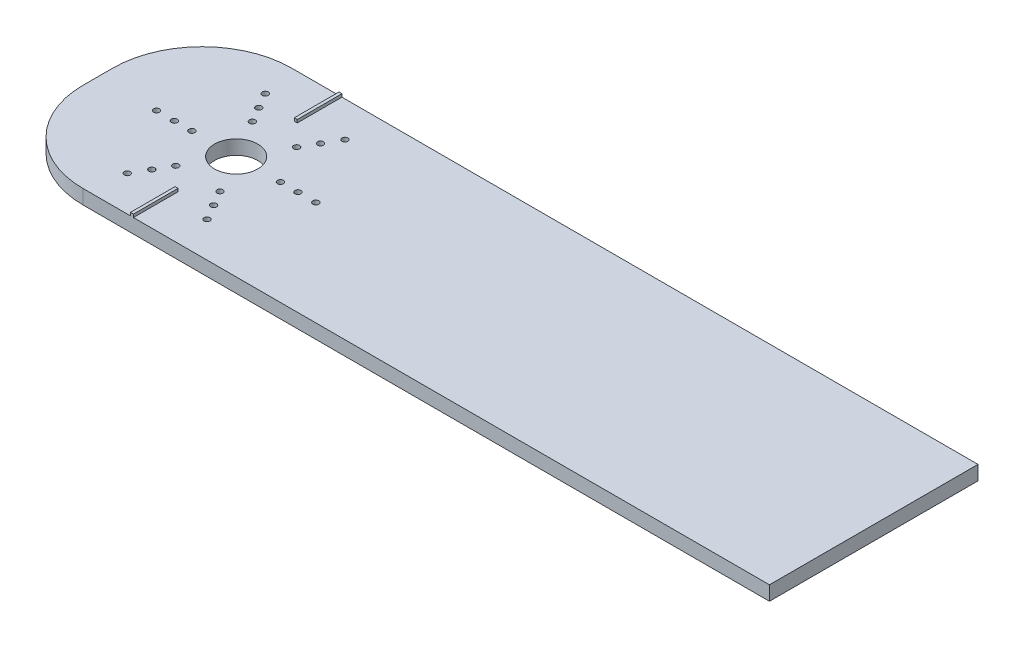
ISO-10303-21;
HEADER;
FILE_DESCRIPTION(('STEP AP214'),'2;1');
FILE_NAME('part.step','',(''),(''),'','','');
FILE_SCHEMA(('AUTOMOTIVE_DESIGN { 1 0 10303 214 1 1 1 1 }'));
ENDSEC;
DATA;
#1=APPLICATION_CONTEXT('core data for automotive mechanical design processes');
#2=APPLICATION_PROTOCOL_DEFINITION('international standard','automotive_design',2000,#1);
#3=PRODUCT_CONTEXT('',#1,'mechanical');
#4=PRODUCT('Part','Part','',(#3));
#5=PRODUCT_RELATED_PRODUCT_CATEGORY('part','',(#4));
#6=PRODUCT_DEFINITION_FORMATION('','',#4);
#7=PRODUCT_DEFINITION_CONTEXT('part definition',#1,'design');
#8=PRODUCT_DEFINITION('design','',#6,#7);
#9=PRODUCT_DEFINITION_SHAPE('','',#8);
#10=(LENGTH_UNIT() NAMED_UNIT(*) SI_UNIT(.MILLI.,.METRE.));
#11=(NAMED_UNIT(*) PLANE_ANGLE_UNIT() SI_UNIT($,.RADIAN.));
#12=(NAMED_UNIT(*) SI_UNIT($,.STERADIAN.) SOLID_ANGLE_UNIT());
#13=UNCERTAINTY_MEASURE_WITH_UNIT(LENGTH_MEASURE(1.E-05),#10,'distance_accuracy_value','');
#14=(GEOMETRIC_REPRESENTATION_CONTEXT(3) GLOBAL_UNCERTAINTY_ASSIGNED_CONTEXT((#13)) GLOBAL_UNIT_ASSIGNED_CONTEXT((#10,
#11,#12)) REPRESENTATION_CONTEXT('',''));
#15=CARTESIAN_POINT('',(0.,0.,0.));
#16=DIRECTION('',(0.,0.,1.));
#17=DIRECTION('',(1.,0.,0.));
#18=AXIS2_PLACEMENT_3D('',#15,#16,#17);
#19=CARTESIAN_POINT('',(0.,2.4,0.));
#20=DIRECTION('',(0.,1.,0.));
#21=DIRECTION('',(0.,0.,1.));
#22=AXIS2_PLACEMENT_3D('',#19,#20,#21);
#23=PLANE('',#22);
#24=CARTESIAN_POINT('',(24.2379461756374,2.4,-15.061181958097));
#25=DIRECTION('',(0.,1.,0.));
#26=DIRECTION('',(0.,0.,1.));
#27=AXIS2_PLACEMENT_3D('',#24,#25,#26);
#28=CIRCLE('',#27,0.499999999999995);
#29=CARTESIAN_POINT('',(24.2379461756374,2.4,-14.561181958097));
#30=VERTEX_POINT('',#29);
#31=EDGE_CURVE('E201',#30,#30,#28,.T.);
#32=ORIENTED_EDGE('',*,*,#31,.F.);
#33=EDGE_LOOP('',(#32));
#34=FACE_BOUND('',#33,.T.);
#35=CARTESIAN_POINT('',(33.8929461756374,2.4,-21.4957507082154));
#36=DIRECTION('',(0.,1.,0.));
#37=DIRECTION('',(0.,0.,1.));
#38=AXIS2_PLACEMENT_3D('',#35,#36,#37);
#39=CIRCLE('',#38,0.499999999999998);
#40=CARTESIAN_POINT('',(33.8929461756374,2.4,-20.9957507082154));
#41=VERTEX_POINT('',#40);
#42=EDGE_CURVE('E232',#41,#41,#39,.T.);
#43=ORIENTED_EDGE('',*,*,#42,.F.);
#44=EDGE_LOOP('',(#43));
#45=FACE_BOUND('',#44,.T.);
#46=CARTESIAN_POINT('',(30.8879461756374,2.4,-21.4957507082154));
#47=DIRECTION('',(0.,1.,0.));
#48=DIRECTION('',(0.,0.,1.));
#49=AXIS2_PLACEMENT_3D('',#46,#47,#48);
#50=CIRCLE('',#49,0.499999999999998);
#51=CARTESIAN_POINT('',(30.8879461756374,2.4,-20.9957507082154));
#52=VERTEX_POINT('',#51);
#53=EDGE_CURVE('E231',#52,#52,#50,.T.);
#54=ORIENTED_EDGE('',*,*,#53,.F.);
#55=EDGE_LOOP('',(#54));
#56=FACE_BOUND('',#55,.T.);
#57=CARTESIAN_POINT('',(7.15294617563741,2.4,-21.4957507082153));
#58=DIRECTION('',(0.,1.,0.));
#59=DIRECTION('',(0.,0.,1.));
#60=AXIS2_PLACEMENT_3D('',#57,#58,#59);
#61=CIRCLE('',#60,0.499999999999999);
#62=CARTESIAN_POINT('',(7.15294617563741,2.4,-20.9957507082153));
#63=VERTEX_POINT('',#62);
#64=EDGE_CURVE('E244',#63,#63,#61,.T.);
#65=ORIENTED_EDGE('',*,*,#64,.F.);
#66=EDGE_LOOP('',(#65));
#67=FACE_BOUND('',#66,.T.);
#68=CARTESIAN_POINT('',(25.7054461756374,2.4,-12.5193973979897));
#69=DIRECTION('',(0.,1.,0.));
#70=DIRECTION('',(0.,0.,1.));
#71=AXIS2_PLACEMENT_3D('',#68,#69,#70);
#72=CIRCLE('',#71,0.499999999999998);
#73=CARTESIAN_POINT('',(25.7054461756374,2.4,-12.0193973979897));
#74=VERTEX_POINT('',#73);
#75=EDGE_CURVE('E202',#74,#74,#72,.T.);
#76=ORIENTED_EDGE('',*,*,#75,.F.);
#77=EDGE_LOOP('',(#76));
#78=FACE_BOUND('',#77,.T.);
#79=CARTESIAN_POINT('',(27.2079461756374,2.4,-9.91699105961743));
#80=DIRECTION('',(0.,1.,0.));
#81=DIRECTION('',(0.,0.,1.));
#82=AXIS2_PLACEMENT_3D('',#79,#80,#81);
#83=CIRCLE('',#82,0.499999999999998);
#84=CARTESIAN_POINT('',(27.2079461756374,2.4,-9.41699105961743));
#85=VERTEX_POINT('',#84);
#86=EDGE_CURVE('E208',#85,#85,#83,.T.);
#87=ORIENTED_EDGE('',*,*,#86,.F.);
#88=EDGE_LOOP('',(#87));
#89=FACE_BOUND('',#88,.T.);
#90=CARTESIAN_POINT('',(16.8079461756374,2.4,-15.061181958097));
#91=DIRECTION('',(0.,1.,0.));
#92=DIRECTION('',(0.,0.,1.));
#93=AXIS2_PLACEMENT_3D('',#90,#91,#92);
#94=CIRCLE('',#93,0.499999999999998);
#95=CARTESIAN_POINT('',(16.8079461756374,2.4,-14.561181958097));
#96=VERTEX_POINT('',#95);
#97=EDGE_CURVE('E214',#96,#96,#94,.T.);
#98=ORIENTED_EDGE('',*,*,#97,.F.);
#99=EDGE_LOOP('',(#98));
#100=FACE_BOUND('',#99,.T.);
#101=CARTESIAN_POINT('',(15.3404461756374,2.4,-12.5193973979897));
#102=DIRECTION('',(0.,1.,0.));
#103=DIRECTION('',(0.,0.,1.));
#104=AXIS2_PLACEMENT_3D('',#101,#102,#103);
#105=CIRCLE('',#104,0.500000000000001);
#106=CARTESIAN_POINT('',(15.3404461756374,2.4,-12.0193973979897));
#107=VERTEX_POINT('',#106);
#108=EDGE_CURVE('E220',#107,#107,#105,.T.);
#109=ORIENTED_EDGE('',*,*,#108,.F.);
#110=EDGE_LOOP('',(#109));
#111=FACE_BOUND('',#110,.T.);
#112=CARTESIAN_POINT('',(13.8379461756374,2.4,-9.91699105961747));
#113=DIRECTION('',(0.,1.,0.));
#114=DIRECTION('',(0.,0.,1.));
#115=AXIS2_PLACEMENT_3D('',#112,#113,#114);
#116=CIRCLE('',#115,0.499999999999997);
#117=CARTESIAN_POINT('',(13.8379461756374,2.4,-9.41699105961747));
#118=VERTEX_POINT('',#117);
#119=EDGE_CURVE('E197',#118,#118,#116,.T.);
#120=ORIENTED_EDGE('',*,*,#119,.F.);
#121=EDGE_LOOP('',(#120));
#122=FACE_BOUND('',#121,.T.);
#123=CARTESIAN_POINT('',(15.3404461756373,2.4,-30.4721040184411));
#124=DIRECTION('',(0.,1.,0.));
#125=DIRECTION('',(0.,0.,1.));
#126=AXIS2_PLACEMENT_3D('',#123,#124,#125);
#127=CIRCLE('',#126,0.500000000000003);
#128=CARTESIAN_POINT('',(15.3404461756373,2.4,-29.9721040184411));
#129=VERTEX_POINT('',#128);
#130=EDGE_CURVE('E286',#129,#129,#127,.T.);
#131=ORIENTED_EDGE('',*,*,#130,.F.);
#132=EDGE_LOOP('',(#131));
#133=FACE_BOUND('',#132,.T.);
#134=CARTESIAN_POINT('',(13.8379461756374,2.4,-33.0745103568133));
#135=DIRECTION('',(0.,1.,0.));
#136=DIRECTION('',(0.,0.,1.));
#137=AXIS2_PLACEMENT_3D('',#134,#135,#136);
#138=CIRCLE('',#137,0.499999999999999);
#139=CARTESIAN_POINT('',(13.8379461756374,2.4,-32.5745103568133));
#140=VERTEX_POINT('',#139);
#141=EDGE_CURVE('E292',#140,#140,#138,.T.);
#142=ORIENTED_EDGE('',*,*,#141,.F.);
#143=EDGE_LOOP('',(#142));
#144=FACE_BOUND('',#143,.T.);
#145=CARTESIAN_POINT('',(24.2379461756374,2.4,-27.9303194583338));
#146=DIRECTION('',(0.,1.,0.));
#147=DIRECTION('',(0.,0.,1.));
#148=AXIS2_PLACEMENT_3D('',#145,#146,#147);
#149=CIRCLE('',#148,0.500000000000001);
#150=CARTESIAN_POINT('',(24.2379461756374,2.4,-27.4303194583338));
#151=VERTEX_POINT('',#150);
#152=EDGE_CURVE('E298',#151,#151,#149,.T.);
#153=ORIENTED_EDGE('',*,*,#152,.F.);
#154=EDGE_LOOP('',(#153));
#155=FACE_BOUND('',#154,.T.);
#156=CARTESIAN_POINT('',(25.7054461756374,2.4,-30.4721040184411));
#157=DIRECTION('',(0.,1.,0.));
#158=DIRECTION('',(0.,0.,1.));
#159=AXIS2_PLACEMENT_3D('',#156,#157,#158);
#160=CIRCLE('',#159,0.500000000000001);
#161=CARTESIAN_POINT('',(25.7054461756374,2.4,-29.9721040184411));
#162=VERTEX_POINT('',#161);
#163=EDGE_CURVE('E255',#162,#162,#160,.T.);
#164=ORIENTED_EDGE('',*,*,#163,.F.);
#165=EDGE_LOOP('',(#164));
#166=FACE_BOUND('',#165,.T.);
#167=CARTESIAN_POINT('',(27.2079461756374,2.4,-33.0745103568134));
#168=DIRECTION('',(0.,1.,0.));
#169=DIRECTION('',(0.,0.,1.));
#170=AXIS2_PLACEMENT_3D('',#167,#168,#169);
#171=CIRCLE('',#170,0.500000000000001);
#172=CARTESIAN_POINT('',(27.2079461756374,2.4,-32.5745103568134));
#173=VERTEX_POINT('',#172);
#174=EDGE_CURVE('E256',#173,#173,#171,.T.);
#175=ORIENTED_EDGE('',*,*,#174,.F.);
#176=EDGE_LOOP('',(#175));
#177=FACE_BOUND('',#176,.T.);
#178=CARTESIAN_POINT('',(27.9529461756374,2.4,-21.4957507082154));
#179=DIRECTION('',(0.,1.,0.));
#180=DIRECTION('',(0.,0.,1.));
#181=AXIS2_PLACEMENT_3D('',#178,#179,#180);
#182=CIRCLE('',#181,0.499999999999998);
#183=CARTESIAN_POINT('',(27.9529461756374,2.4,-20.9957507082154));
#184=VERTEX_POINT('',#183);
#185=EDGE_CURVE('E262',#184,#184,#182,.T.);
#186=ORIENTED_EDGE('',*,*,#185,.F.);
#187=EDGE_LOOP('',(#186));
#188=FACE_BOUND('',#187,.T.);
#189=CARTESIAN_POINT('',(20.5229461756374,2.4,-21.4957507082153));
#190=DIRECTION('',(0.,1.,0.));
#191=DIRECTION('',(0.,0.,1.));
#192=AXIS2_PLACEMENT_3D('',#189,#190,#191);
#193=CIRCLE('',#192,3.625);
#194=CARTESIAN_POINT('',(20.5229461756374,2.4,-17.8707507082153));
#195=VERTEX_POINT('',#194);
#196=EDGE_CURVE('E268',#195,#195,#193,.T.);
#197=ORIENTED_EDGE('',*,*,#196,.F.);
#198=EDGE_LOOP('',(#197));
#199=FACE_BOUND('',#198,.T.);
#200=CARTESIAN_POINT('',(13.0929461756374,2.4,-21.4957507082153));
#201=DIRECTION('',(0.,1.,0.));
#202=DIRECTION('',(0.,0.,1.));
#203=AXIS2_PLACEMENT_3D('',#200,#201,#202);
#204=CIRCLE('',#203,0.499999999999999);
#205=CARTESIAN_POINT('',(13.0929461756374,2.4,-20.9957507082153));
#206=VERTEX_POINT('',#205);
#207=EDGE_CURVE('E274',#206,#206,#204,.T.);
#208=ORIENTED_EDGE('',*,*,#207,.F.);
#209=EDGE_LOOP('',(#208));
#210=FACE_BOUND('',#209,.T.);
#211=CARTESIAN_POINT('',(10.1579461756374,2.4,-21.4957507082153));
#212=DIRECTION('',(0.,1.,0.));
#213=DIRECTION('',(0.,0.,1.));
#214=AXIS2_PLACEMENT_3D('',#211,#212,#213);
#215=CIRCLE('',#214,0.499999999999999);
#216=CARTESIAN_POINT('',(10.1579461756374,2.4,-20.9957507082153));
#217=VERTEX_POINT('',#216);
#218=EDGE_CURVE('E243',#217,#217,#215,.T.);
#219=ORIENTED_EDGE('',*,*,#218,.F.);
#220=EDGE_LOOP('',(#219));
#221=FACE_BOUND('',#220,.T.);
#222=CARTESIAN_POINT('',(16.8079461756373,2.4,-27.9303194583337));
#223=DIRECTION('',(0.,1.,0.));
#224=DIRECTION('',(0.,0.,1.));
#225=AXIS2_PLACEMENT_3D('',#222,#223,#224);
#226=CIRCLE('',#225,0.499999999999999);
#227=CARTESIAN_POINT('',(16.8079461756373,2.4,-27.4303194583337));
#228=VERTEX_POINT('',#227);
#229=EDGE_CURVE('E285',#228,#228,#226,.T.);
#230=ORIENTED_EDGE('',*,*,#229,.F.);
#231=EDGE_LOOP('',(#230));
#232=FACE_BOUND('',#231,.T.);
#233=DIRECTION('',(0.,0.,1.));
#234=VECTOR('',#233,1.);
#235=CARTESIAN_POINT('',(-2.67705382436262,2.4,-38.9957507082153));
#236=LINE('',#235,#234);
#237=CARTESIAN_POINT('',(-2.67705382436261,2.4,-23.9957507082153));
#238=VERTEX_POINT('',#237);
#239=CARTESIAN_POINT('',(-2.67705382436261,2.4,-18.9957507082153));
#240=VERTEX_POINT('',#239);
#241=EDGE_CURVE('E312',#238,#240,#236,.T.);
#242=ORIENTED_EDGE('',*,*,#241,.T.);
#243=CARTESIAN_POINT('',(12.3229461756374,2.4,-18.9957507082153));
#244=DIRECTION('',(0.,1.,0.));
#245=DIRECTION('',(0.,0.,1.));
#246=AXIS2_PLACEMENT_3D('',#243,#244,#245);
#247=CIRCLE('',#246,15.);
#248=CARTESIAN_POINT('',(12.3229461756374,2.4,-3.99575070821528));
#249=VERTEX_POINT('',#248);
#250=EDGE_CURVE('E41',#240,#249,#247,.T.);
#251=ORIENTED_EDGE('',*,*,#250,.T.);
#252=DIRECTION('',(1.,0.,0.));
#253=VECTOR('',#252,1.);
#254=CARTESIAN_POINT('',(-2.6770538243626,2.4,-3.99575070821528));
#255=LINE('',#254,#253);
#256=CARTESIAN_POINT('',(20.2729461756374,2.4,-3.99575070821528));
#257=VERTEX_POINT('',#256);
#258=EDGE_CURVE('E315',#249,#257,#255,.T.);
#259=ORIENTED_EDGE('',*,*,#258,.T.);
#260=DIRECTION('',(0.,0.,1.));
#261=VECTOR('',#260,1.);
#262=CARTESIAN_POINT('',(20.2729461756374,2.4,-3.99575070821528));
#263=LINE('',#262,#261);
#264=CARTESIAN_POINT('',(20.2729461756374,2.4,-11.4957507082153));
#265=VERTEX_POINT('',#264);
#266=EDGE_CURVE('E155',#265,#257,#263,.T.);
#267=ORIENTED_EDGE('',*,*,#266,.F.);
#268=DIRECTION('',(-1.,0.,0.));
#269=VECTOR('',#268,1.);
#270=CARTESIAN_POINT('',(20.2729461756374,2.4,-11.4957507082153));
#271=LINE('',#270,#269);
#272=CARTESIAN_POINT('',(20.7729461756374,2.4,-11.4957507082153));
#273=VERTEX_POINT('',#272);
#274=EDGE_CURVE('E373',#273,#265,#271,.T.);
#275=ORIENTED_EDGE('',*,*,#274,.F.);
#276=DIRECTION('',(0.,0.,-1.));
#277=VECTOR('',#276,1.);
#278=CARTESIAN_POINT('',(20.7729461756374,2.4,-3.99575070821528));
#279=LINE('',#278,#277);
#280=CARTESIAN_POINT('',(20.7729461756374,2.4,-3.99575070821528));
#281=VERTEX_POINT('',#280);
#282=EDGE_CURVE('E371',#281,#273,#279,.T.);
#283=ORIENTED_EDGE('',*,*,#282,.F.);
#284=CARTESIAN_POINT('',(127.522946175637,2.4,-3.99575070821528));
#285=VERTEX_POINT('',#284);
#286=EDGE_CURVE('E161',#281,#285,#255,.T.);
#287=ORIENTED_EDGE('',*,*,#286,.T.);
#288=DIRECTION('',(0.,0.,-1.));
#289=VECTOR('',#288,1.);
#290=CARTESIAN_POINT('',(127.522946175637,2.4,-38.9957507082153));
#291=LINE('',#290,#289);
#292=CARTESIAN_POINT('',(127.522946175637,2.4,-38.9957507082153));
#293=VERTEX_POINT('',#292);
#294=EDGE_CURVE('E317',#285,#293,#291,.T.);
#295=ORIENTED_EDGE('',*,*,#294,.T.);
#296=DIRECTION('',(-1.,0.,0.));
#297=VECTOR('',#296,1.);
#298=CARTESIAN_POINT('',(-2.67705382436262,2.4,-38.9957507082153));
#299=LINE('',#298,#297);
#300=CARTESIAN_POINT('',(20.7729461756374,2.4,-38.9957507082153));
#301=VERTEX_POINT('',#300);
#302=EDGE_CURVE('E320',#293,#301,#299,.T.);
#303=ORIENTED_EDGE('',*,*,#302,.T.);
#304=DIRECTION('',(0.,0.,-1.));
#305=VECTOR('',#304,1.);
#306=CARTESIAN_POINT('',(20.7729461756374,2.4,-38.9957507082153));
#307=LINE('',#306,#305);
#308=CARTESIAN_POINT('',(20.7729461756374,2.4,-31.4957507082153));
#309=VERTEX_POINT('',#308);
#310=EDGE_CURVE('E175',#309,#301,#307,.T.);
#311=ORIENTED_EDGE('',*,*,#310,.F.);
#312=DIRECTION('',(1.,0.,0.));
#313=VECTOR('',#312,1.);
#314=CARTESIAN_POINT('',(20.2729461756374,2.4,-31.4957507082153));
#315=LINE('',#314,#313);
#316=CARTESIAN_POINT('',(20.2729461756374,2.4,-31.4957507082153));
#317=VERTEX_POINT('',#316);
#318=EDGE_CURVE('E165',#317,#309,#315,.T.);
#319=ORIENTED_EDGE('',*,*,#318,.F.);
#320=DIRECTION('',(0.,0.,1.));
#321=VECTOR('',#320,1.);
#322=CARTESIAN_POINT('',(20.2729461756374,2.4,-38.9957507082153));
#323=LINE('',#322,#321);
#324=CARTESIAN_POINT('',(20.2729461756374,2.4,-38.9957507082153));
#325=VERTEX_POINT('',#324);
#326=EDGE_CURVE('E162',#325,#317,#323,.T.);
#327=ORIENTED_EDGE('',*,*,#326,.F.);
#328=CARTESIAN_POINT('',(12.3229461756374,2.4,-38.9957507082153));
#329=VERTEX_POINT('',#328);
#330=EDGE_CURVE('E319',#325,#329,#299,.T.);
#331=ORIENTED_EDGE('',*,*,#330,.T.);
#332=CARTESIAN_POINT('',(12.3229461756374,2.4,-23.9957507082153));
#333=DIRECTION('',(0.,1.,0.));
#334=DIRECTION('',(0.,0.,1.));
#335=AXIS2_PLACEMENT_3D('',#332,#333,#334);
#336=CIRCLE('',#335,15.);
#337=EDGE_CURVE('E345',#329,#238,#336,.T.);
#338=ORIENTED_EDGE('',*,*,#337,.T.);
#339=EDGE_LOOP('',(#242,#251,#259,#267,#275,#283,#287,#295,#303,#311,#319,#327,#331,#338));
#340=FACE_BOUND('',#339,.T.);
#341=ADVANCED_FACE('F33',(#34,#45,#56,#67,#78,#89,#100,#111,#122,#133,#144,#155,#166,#177,#188,
#199,#210,#221,#232,#340),#23,.T.);
#342=CARTESIAN_POINT('',(-2.67705382436262,2.4,-38.9957507082153));
#343=DIRECTION('',(1.,0.,0.));
#344=DIRECTION('',(0.,0.,-1.));
#345=AXIS2_PLACEMENT_3D('',#342,#343,#344);
#346=PLANE('',#345);
#347=DIRECTION('',(0.,0.,1.));
#348=VECTOR('',#347,1.);
#349=CARTESIAN_POINT('',(-2.67705382436262,0.,-38.9957507082153));
#350=LINE('',#349,#348);
#351=CARTESIAN_POINT('',(-2.67705382436261,0.,-23.9957507082153));
#352=VERTEX_POINT('',#351);
#353=CARTESIAN_POINT('',(-2.67705382436261,0.,-18.9957507082153));
#354=VERTEX_POINT('',#353);
#355=EDGE_CURVE('E309',#352,#354,#350,.T.);
#356=ORIENTED_EDGE('',*,*,#355,.T.);
#357=DIRECTION('',(0.,-1.,0.));
#358=VECTOR('',#357,1.);
#359=CARTESIAN_POINT('',(-2.67705382436261,2.4,-18.9957507082153));
#360=LINE('',#359,#358);
#361=EDGE_CURVE('E54',#354,#240,#360,.F.);
#362=ORIENTED_EDGE('',*,*,#361,.T.);
#363=ORIENTED_EDGE('',*,*,#241,.F.);
#364=DIRECTION('',(0.,-1.,0.));
#365=VECTOR('',#364,1.);
#366=CARTESIAN_POINT('',(-2.67705382436261,2.4,-23.9957507082153));
#367=LINE('',#366,#365);
#368=EDGE_CURVE('E341',#238,#352,#367,.T.);
#369=ORIENTED_EDGE('',*,*,#368,.T.);
#370=EDGE_LOOP('',(#356,#362,#363,#369));
#371=FACE_BOUND('',#370,.T.);
#372=ADVANCED_FACE('F359',(#371),#346,.F.);
#373=CARTESIAN_POINT('',(-2.6770538243626,2.4,-3.99575070821528));
#374=DIRECTION('',(0.,0.,-1.));
#375=DIRECTION('',(-1.,0.,0.));
#376=AXIS2_PLACEMENT_3D('',#373,#374,#375);
#377=PLANE('',#376);
#378=ORIENTED_EDGE('',*,*,#258,.F.);
#379=DIRECTION('',(0.,-1.,0.));
#380=VECTOR('',#379,1.);
#381=CARTESIAN_POINT('',(12.3229461756374,2.4,-3.99575070821528));
#382=LINE('',#381,#380);
#383=CARTESIAN_POINT('',(12.3229461756374,0.,-3.99575070821528));
#384=VERTEX_POINT('',#383);
#385=EDGE_CURVE('E334',#249,#384,#382,.T.);
#386=ORIENTED_EDGE('',*,*,#385,.T.);
#387=DIRECTION('',(1.,0.,0.));
#388=VECTOR('',#387,1.);
#389=CARTESIAN_POINT('',(-2.6770538243626,0.,-3.99575070821528));
#390=LINE('',#389,#388);
#391=CARTESIAN_POINT('',(127.522946175637,0.,-3.99575070821528));
#392=VERTEX_POINT('',#391);
#393=EDGE_CURVE('E324',#384,#392,#390,.T.);
#394=ORIENTED_EDGE('',*,*,#393,.T.);
#395=DIRECTION('',(0.,-1.,0.));
#396=VECTOR('',#395,1.);
#397=CARTESIAN_POINT('',(127.522946175637,2.4,-3.99575070821528));
#398=LINE('',#397,#396);
#399=EDGE_CURVE('E331',#285,#392,#398,.T.);
#400=ORIENTED_EDGE('',*,*,#399,.F.);
#401=ORIENTED_EDGE('',*,*,#286,.F.);
#402=DIRECTION('',(0.,-1.,0.));
#403=VECTOR('',#402,1.);
#404=CARTESIAN_POINT('',(20.7729461756374,2.9,-3.99575070821528));
#405=LINE('',#404,#403);
#406=CARTESIAN_POINT('',(20.7729461756374,2.9,-3.99575070821528));
#407=VERTEX_POINT('',#406);
#408=EDGE_CURVE('E139',#407,#281,#405,.T.);
#409=ORIENTED_EDGE('',*,*,#408,.F.);
#410=DIRECTION('',(1.,0.,0.));
#411=VECTOR('',#410,1.);
#412=CARTESIAN_POINT('',(20.2729461756374,2.9,-3.99575070821528));
#413=LINE('',#412,#411);
#414=CARTESIAN_POINT('',(20.2729461756374,2.9,-3.99575070821528));
#415=VERTEX_POINT('',#414);
#416=EDGE_CURVE('E146',#415,#407,#413,.T.);
#417=ORIENTED_EDGE('',*,*,#416,.F.);
#418=DIRECTION('',(0.,-1.,0.));
#419=VECTOR('',#418,1.);
#420=CARTESIAN_POINT('',(20.2729461756374,2.9,-3.99575070821528));
#421=LINE('',#420,#419);
#422=EDGE_CURVE('E353',#415,#257,#421,.T.);
#423=ORIENTED_EDGE('',*,*,#422,.T.);
#424=EDGE_LOOP('',(#378,#386,#394,#400,#401,#409,#417,#423));
#425=FACE_BOUND('',#424,.T.);
#426=ADVANCED_FACE('F159',(#425),#377,.F.);
#427=CARTESIAN_POINT('',(127.522946175637,2.4,-38.9957507082153));
#428=DIRECTION('',(-1.,0.,0.));
#429=DIRECTION('',(0.,0.,1.));
#430=AXIS2_PLACEMENT_3D('',#427,#428,#429);
#431=PLANE('',#430);
#432=DIRECTION('',(0.,0.,-1.));
#433=VECTOR('',#432,1.);
#434=CARTESIAN_POINT('',(127.522946175637,0.,-38.9957507082153));
#435=LINE('',#434,#433);
#436=CARTESIAN_POINT('',(127.522946175637,0.,-38.9957507082153));
#437=VERTEX_POINT('',#436);
#438=EDGE_CURVE('E326',#392,#437,#435,.T.);
#439=ORIENTED_EDGE('',*,*,#438,.T.);
#440=DIRECTION('',(0.,-1.,0.));
#441=VECTOR('',#440,1.);
#442=CARTESIAN_POINT('',(127.522946175637,2.4,-38.9957507082153));
#443=LINE('',#442,#441);
#444=EDGE_CURVE('E322',#293,#437,#443,.T.);
#445=ORIENTED_EDGE('',*,*,#444,.F.);
#446=ORIENTED_EDGE('',*,*,#294,.F.);
#447=ORIENTED_EDGE('',*,*,#399,.T.);
#448=EDGE_LOOP('',(#439,#445,#446,#447));
#449=FACE_BOUND('',#448,.T.);
#450=ADVANCED_FACE('F369',(#449),#431,.F.);
#451=CARTESIAN_POINT('',(-2.67705382436262,2.4,-38.9957507082153));
#452=DIRECTION('',(0.,0.,1.));
#453=DIRECTION('',(1.,0.,0.));
#454=AXIS2_PLACEMENT_3D('',#451,#452,#453);
#455=PLANE('',#454);
#456=DIRECTION('',(-1.,0.,0.));
#457=VECTOR('',#456,1.);
#458=CARTESIAN_POINT('',(-2.67705382436262,0.,-38.9957507082153));
#459=LINE('',#458,#457);
#460=CARTESIAN_POINT('',(12.3229461756374,0.,-38.9957507082153));
#461=VERTEX_POINT('',#460);
#462=EDGE_CURVE('E314',#437,#461,#459,.T.);
#463=ORIENTED_EDGE('',*,*,#462,.T.);
#464=DIRECTION('',(0.,-1.,0.));
#465=VECTOR('',#464,1.);
#466=CARTESIAN_POINT('',(12.3229461756374,2.4,-38.9957507082153));
#467=LINE('',#466,#465);
#468=EDGE_CURVE('E11',#461,#329,#467,.F.);
#469=ORIENTED_EDGE('',*,*,#468,.T.);
#470=ORIENTED_EDGE('',*,*,#330,.F.);
#471=DIRECTION('',(0.,-1.,0.));
#472=VECTOR('',#471,1.);
#473=CARTESIAN_POINT('',(20.2729461756374,2.9,-38.9957507082153));
#474=LINE('',#473,#472);
#475=CARTESIAN_POINT('',(20.2729461756374,2.9,-38.9957507082153));
#476=VERTEX_POINT('',#475);
#477=EDGE_CURVE('E180',#476,#325,#474,.T.);
#478=ORIENTED_EDGE('',*,*,#477,.F.);
#479=DIRECTION('',(-1.,0.,0.));
#480=VECTOR('',#479,1.);
#481=CARTESIAN_POINT('',(20.2729461756374,2.9,-38.9957507082153));
#482=LINE('',#481,#480);
#483=CARTESIAN_POINT('',(20.7729461756374,2.9,-38.9957507082153));
#484=VERTEX_POINT('',#483);
#485=EDGE_CURVE('E179',#484,#476,#482,.T.);
#486=ORIENTED_EDGE('',*,*,#485,.F.);
#487=DIRECTION('',(0.,-1.,0.));
#488=VECTOR('',#487,1.);
#489=CARTESIAN_POINT('',(20.7729461756374,2.9,-38.9957507082153));
#490=LINE('',#489,#488);
#491=EDGE_CURVE('E188',#484,#301,#490,.T.);
#492=ORIENTED_EDGE('',*,*,#491,.T.);
#493=ORIENTED_EDGE('',*,*,#302,.F.);
#494=ORIENTED_EDGE('',*,*,#444,.T.);
#495=EDGE_LOOP('',(#463,#469,#470,#478,#486,#492,#493,#494));
#496=FACE_BOUND('',#495,.T.);
#497=ADVANCED_FACE('F364',(#496),#455,.F.);
#498=CARTESIAN_POINT('',(0.,0.,0.));
#499=DIRECTION('',(0.,1.,0.));
#500=DIRECTION('',(0.,0.,1.));
#501=AXIS2_PLACEMENT_3D('',#498,#499,#500);
#502=PLANE('',#501);
#503=CARTESIAN_POINT('',(24.2379461756374,0.,-15.061181958097));
#504=DIRECTION('',(0.,1.,0.));
#505=DIRECTION('',(0.,0.,1.));
#506=AXIS2_PLACEMENT_3D('',#503,#504,#505);
#507=CIRCLE('',#506,0.499999999999995);
#508=CARTESIAN_POINT('',(24.2379461756374,0.,-14.561181958097));
#509=VERTEX_POINT('',#508);
#510=EDGE_CURVE('E235',#509,#509,#507,.T.);
#511=ORIENTED_EDGE('',*,*,#510,.T.);
#512=EDGE_LOOP('',(#511));
#513=FACE_BOUND('',#512,.T.);
#514=CARTESIAN_POINT('',(33.8929461756374,0.,-21.4957507082154));
#515=DIRECTION('',(0.,1.,0.));
#516=DIRECTION('',(0.,0.,1.));
#517=AXIS2_PLACEMENT_3D('',#514,#515,#516);
#518=CIRCLE('',#517,0.499999999999998);
#519=CARTESIAN_POINT('',(33.8929461756374,0.,-20.9957507082154));
#520=VERTEX_POINT('',#519);
#521=EDGE_CURVE('E228',#520,#520,#518,.T.);
#522=ORIENTED_EDGE('',*,*,#521,.T.);
#523=EDGE_LOOP('',(#522));
#524=FACE_BOUND('',#523,.T.);
#525=CARTESIAN_POINT('',(30.8879461756374,0.,-21.4957507082154));
#526=DIRECTION('',(0.,1.,0.));
#527=DIRECTION('',(0.,0.,1.));
#528=AXIS2_PLACEMENT_3D('',#525,#526,#527);
#529=CIRCLE('',#528,0.499999999999998);
#530=CARTESIAN_POINT('',(30.8879461756374,0.,-20.9957507082154));
#531=VERTEX_POINT('',#530);
#532=EDGE_CURVE('E247',#531,#531,#529,.T.);
#533=ORIENTED_EDGE('',*,*,#532,.T.);
#534=EDGE_LOOP('',(#533));
#535=FACE_BOUND('',#534,.T.);
#536=CARTESIAN_POINT('',(7.15294617563741,0.,-21.4957507082153));
#537=DIRECTION('',(0.,1.,0.));
#538=DIRECTION('',(0.,0.,1.));
#539=AXIS2_PLACEMENT_3D('',#536,#537,#538);
#540=CIRCLE('',#539,0.499999999999999);
#541=CARTESIAN_POINT('',(7.15294617563741,0.,-20.9957507082153));
#542=VERTEX_POINT('',#541);
#543=EDGE_CURVE('E240',#542,#542,#540,.T.);
#544=ORIENTED_EDGE('',*,*,#543,.T.);
#545=EDGE_LOOP('',(#544));
#546=FACE_BOUND('',#545,.T.);
#547=CARTESIAN_POINT('',(25.7054461756374,0.,-12.5193973979897));
#548=DIRECTION('',(0.,1.,0.));
#549=DIRECTION('',(0.,0.,1.));
#550=AXIS2_PLACEMENT_3D('',#547,#548,#549);
#551=CIRCLE('',#550,0.499999999999998);
#552=CARTESIAN_POINT('',(25.7054461756374,0.,-12.0193973979897));
#553=VERTEX_POINT('',#552);
#554=EDGE_CURVE('E198',#553,#553,#551,.T.);
#555=ORIENTED_EDGE('',*,*,#554,.T.);
#556=EDGE_LOOP('',(#555));
#557=FACE_BOUND('',#556,.T.);
#558=CARTESIAN_POINT('',(27.2079461756374,0.,-9.91699105961743));
#559=DIRECTION('',(0.,1.,0.));
#560=DIRECTION('',(0.,0.,1.));
#561=AXIS2_PLACEMENT_3D('',#558,#559,#560);
#562=CIRCLE('',#561,0.499999999999998);
#563=CARTESIAN_POINT('',(27.2079461756374,0.,-9.41699105961743));
#564=VERTEX_POINT('',#563);
#565=EDGE_CURVE('E205',#564,#564,#562,.T.);
#566=ORIENTED_EDGE('',*,*,#565,.T.);
#567=EDGE_LOOP('',(#566));
#568=FACE_BOUND('',#567,.T.);
#569=CARTESIAN_POINT('',(16.8079461756374,0.,-15.061181958097));
#570=DIRECTION('',(0.,1.,0.));
#571=DIRECTION('',(0.,0.,1.));
#572=AXIS2_PLACEMENT_3D('',#569,#570,#571);
#573=CIRCLE('',#572,0.499999999999998);
#574=CARTESIAN_POINT('',(16.8079461756374,0.,-14.561181958097));
#575=VERTEX_POINT('',#574);
#576=EDGE_CURVE('E211',#575,#575,#573,.T.);
#577=ORIENTED_EDGE('',*,*,#576,.T.);
#578=EDGE_LOOP('',(#577));
#579=FACE_BOUND('',#578,.T.);
#580=CARTESIAN_POINT('',(15.3404461756374,0.,-12.5193973979897));
#581=DIRECTION('',(0.,1.,0.));
#582=DIRECTION('',(0.,0.,1.));
#583=AXIS2_PLACEMENT_3D('',#580,#581,#582);
#584=CIRCLE('',#583,0.500000000000001);
#585=CARTESIAN_POINT('',(15.3404461756374,0.,-12.0193973979897));
#586=VERTEX_POINT('',#585);
#587=EDGE_CURVE('E217',#586,#586,#584,.T.);
#588=ORIENTED_EDGE('',*,*,#587,.T.);
#589=EDGE_LOOP('',(#588));
#590=FACE_BOUND('',#589,.T.);
#591=CARTESIAN_POINT('',(13.8379461756374,0.,-9.91699105961747));
#592=DIRECTION('',(0.,1.,0.));
#593=DIRECTION('',(0.,0.,1.));
#594=AXIS2_PLACEMENT_3D('',#591,#592,#593);
#595=CIRCLE('',#594,0.499999999999997);
#596=CARTESIAN_POINT('',(13.8379461756374,0.,-9.41699105961747));
#597=VERTEX_POINT('',#596);
#598=EDGE_CURVE('E223',#597,#597,#595,.T.);
#599=ORIENTED_EDGE('',*,*,#598,.T.);
#600=EDGE_LOOP('',(#599));
#601=FACE_BOUND('',#600,.T.);
#602=CARTESIAN_POINT('',(15.3404461756373,0.,-30.4721040184411));
#603=DIRECTION('',(0.,1.,0.));
#604=DIRECTION('',(0.,0.,1.));
#605=AXIS2_PLACEMENT_3D('',#602,#603,#604);
#606=CIRCLE('',#605,0.500000000000003);
#607=CARTESIAN_POINT('',(15.3404461756373,0.,-29.9721040184411));
#608=VERTEX_POINT('',#607);
#609=EDGE_CURVE('E282',#608,#608,#606,.T.);
#610=ORIENTED_EDGE('',*,*,#609,.T.);
#611=EDGE_LOOP('',(#610));
#612=FACE_BOUND('',#611,.T.);
#613=CARTESIAN_POINT('',(13.8379461756374,0.,-33.0745103568133));
#614=DIRECTION('',(0.,1.,0.));
#615=DIRECTION('',(0.,0.,1.));
#616=AXIS2_PLACEMENT_3D('',#613,#614,#615);
#617=CIRCLE('',#616,0.499999999999999);
#618=CARTESIAN_POINT('',(13.8379461756374,0.,-32.5745103568133));
#619=VERTEX_POINT('',#618);
#620=EDGE_CURVE('E289',#619,#619,#617,.T.);
#621=ORIENTED_EDGE('',*,*,#620,.T.);
#622=EDGE_LOOP('',(#621));
#623=FACE_BOUND('',#622,.T.);
#624=CARTESIAN_POINT('',(24.2379461756374,0.,-27.9303194583338));
#625=DIRECTION('',(0.,1.,0.));
#626=DIRECTION('',(0.,0.,1.));
#627=AXIS2_PLACEMENT_3D('',#624,#625,#626);
#628=CIRCLE('',#627,0.500000000000001);
#629=CARTESIAN_POINT('',(24.2379461756374,0.,-27.4303194583338));
#630=VERTEX_POINT('',#629);
#631=EDGE_CURVE('E295',#630,#630,#628,.T.);
#632=ORIENTED_EDGE('',*,*,#631,.T.);
#633=EDGE_LOOP('',(#632));
#634=FACE_BOUND('',#633,.T.);
#635=CARTESIAN_POINT('',(25.7054461756374,0.,-30.4721040184411));
#636=DIRECTION('',(0.,1.,0.));
#637=DIRECTION('',(0.,0.,1.));
#638=AXIS2_PLACEMENT_3D('',#635,#636,#637);
#639=CIRCLE('',#638,0.500000000000001);
#640=CARTESIAN_POINT('',(25.7054461756374,0.,-29.9721040184411));
#641=VERTEX_POINT('',#640);
#642=EDGE_CURVE('E301',#641,#641,#639,.T.);
#643=ORIENTED_EDGE('',*,*,#642,.T.);
#644=EDGE_LOOP('',(#643));
#645=FACE_BOUND('',#644,.T.);
#646=CARTESIAN_POINT('',(27.2079461756374,0.,-33.0745103568134));
#647=DIRECTION('',(0.,1.,0.));
#648=DIRECTION('',(0.,0.,1.));
#649=AXIS2_PLACEMENT_3D('',#646,#647,#648);
#650=CIRCLE('',#649,0.500000000000001);
#651=CARTESIAN_POINT('',(27.2079461756374,0.,-32.5745103568134));
#652=VERTEX_POINT('',#651);
#653=EDGE_CURVE('E252',#652,#652,#650,.T.);
#654=ORIENTED_EDGE('',*,*,#653,.T.);
#655=EDGE_LOOP('',(#654));
#656=FACE_BOUND('',#655,.T.);
#657=CARTESIAN_POINT('',(27.9529461756374,0.,-21.4957507082154));
#658=DIRECTION('',(0.,1.,0.));
#659=DIRECTION('',(0.,0.,1.));
#660=AXIS2_PLACEMENT_3D('',#657,#658,#659);
#661=CIRCLE('',#660,0.499999999999998);
#662=CARTESIAN_POINT('',(27.9529461756374,0.,-20.9957507082154));
#663=VERTEX_POINT('',#662);
#664=EDGE_CURVE('E259',#663,#663,#661,.T.);
#665=ORIENTED_EDGE('',*,*,#664,.T.);
#666=EDGE_LOOP('',(#665));
#667=FACE_BOUND('',#666,.T.);
#668=CARTESIAN_POINT('',(20.5229461756374,0.,-21.4957507082153));
#669=DIRECTION('',(0.,1.,0.));
#670=DIRECTION('',(0.,0.,1.));
#671=AXIS2_PLACEMENT_3D('',#668,#669,#670);
#672=CIRCLE('',#671,3.625);
#673=CARTESIAN_POINT('',(20.5229461756374,0.,-17.8707507082153));
#674=VERTEX_POINT('',#673);
#675=EDGE_CURVE('E265',#674,#674,#672,.T.);
#676=ORIENTED_EDGE('',*,*,#675,.T.);
#677=EDGE_LOOP('',(#676));
#678=FACE_BOUND('',#677,.T.);
#679=CARTESIAN_POINT('',(13.0929461756374,0.,-21.4957507082153));
#680=DIRECTION('',(0.,1.,0.));
#681=DIRECTION('',(0.,0.,1.));
#682=AXIS2_PLACEMENT_3D('',#679,#680,#681);
#683=CIRCLE('',#682,0.499999999999999);
#684=CARTESIAN_POINT('',(13.0929461756374,0.,-20.9957507082153));
#685=VERTEX_POINT('',#684);
#686=EDGE_CURVE('E271',#685,#685,#683,.T.);
#687=ORIENTED_EDGE('',*,*,#686,.T.);
#688=EDGE_LOOP('',(#687));
#689=FACE_BOUND('',#688,.T.);
#690=CARTESIAN_POINT('',(10.1579461756374,0.,-21.4957507082153));
#691=DIRECTION('',(0.,1.,0.));
#692=DIRECTION('',(0.,0.,1.));
#693=AXIS2_PLACEMENT_3D('',#690,#691,#692);
#694=CIRCLE('',#693,0.499999999999999);
#695=CARTESIAN_POINT('',(10.1579461756374,0.,-20.9957507082153));
#696=VERTEX_POINT('',#695);
#697=EDGE_CURVE('E277',#696,#696,#694,.T.);
#698=ORIENTED_EDGE('',*,*,#697,.T.);
#699=EDGE_LOOP('',(#698));
#700=FACE_BOUND('',#699,.T.);
#701=CARTESIAN_POINT('',(16.8079461756373,0.,-27.9303194583337));
#702=DIRECTION('',(0.,1.,0.));
#703=DIRECTION('',(0.,0.,1.));
#704=AXIS2_PLACEMENT_3D('',#701,#702,#703);
#705=CIRCLE('',#704,0.499999999999999);
#706=CARTESIAN_POINT('',(16.8079461756373,0.,-27.4303194583337));
#707=VERTEX_POINT('',#706);
#708=EDGE_CURVE('E306',#707,#707,#705,.T.);
#709=ORIENTED_EDGE('',*,*,#708,.T.);
#710=EDGE_LOOP('',(#709));
#711=FACE_BOUND('',#710,.T.);
#712=ORIENTED_EDGE('',*,*,#393,.F.);
#713=CARTESIAN_POINT('',(12.3229461756374,0.,-18.9957507082153));
#714=DIRECTION('',(0.,1.,0.));
#715=DIRECTION('',(0.,0.,1.));
#716=AXIS2_PLACEMENT_3D('',#713,#714,#715);
#717=CIRCLE('',#716,15.);
#718=EDGE_CURVE('E339',#384,#354,#717,.F.);
#719=ORIENTED_EDGE('',*,*,#718,.T.);
#720=ORIENTED_EDGE('',*,*,#355,.F.);
#721=CARTESIAN_POINT('',(12.3229461756374,0.,-23.9957507082153));
#722=DIRECTION('',(0.,1.,0.));
#723=DIRECTION('',(0.,0.,1.));
#724=AXIS2_PLACEMENT_3D('',#721,#722,#723);
#725=CIRCLE('',#724,15.);
#726=EDGE_CURVE('E337',#352,#461,#725,.F.);
#727=ORIENTED_EDGE('',*,*,#726,.T.);
#728=ORIENTED_EDGE('',*,*,#462,.F.);
#729=ORIENTED_EDGE('',*,*,#438,.F.);
#730=EDGE_LOOP('',(#712,#719,#720,#727,#728,#729));
#731=FACE_BOUND('',#730,.T.);
#732=ADVANCED_FACE('F357',(#513,#524,#535,#546,#557,#568,#579,#590,#601,#612,#623,#634,#645,
#656,#667,#678,#689,#700,#711,#731),#502,.F.);
#733=CARTESIAN_POINT('',(16.8079461756373,0.,-27.9303194583337));
#734=DIRECTION('',(0.,1.,0.));
#735=DIRECTION('',(0.,0.,1.));
#736=AXIS2_PLACEMENT_3D('',#733,#734,#735);
#737=CYLINDRICAL_SURFACE('',#736,0.499999999999999);
#738=ORIENTED_EDGE('',*,*,#708,.F.);
#739=EDGE_LOOP('',(#738));
#740=FACE_BOUND('',#739,.T.);
#741=ORIENTED_EDGE('',*,*,#229,.T.);
#742=EDGE_LOOP('',(#741));
#743=FACE_BOUND('',#742,.T.);
#744=ADVANCED_FACE('F406',(#740,#743),#737,.F.);
#745=CARTESIAN_POINT('',(10.1579461756374,0.,-21.4957507082153));
#746=DIRECTION('',(0.,1.,0.));
#747=DIRECTION('',(0.,0.,1.));
#748=AXIS2_PLACEMENT_3D('',#745,#746,#747);
#749=CYLINDRICAL_SURFACE('',#748,0.499999999999999);
#750=ORIENTED_EDGE('',*,*,#697,.F.);
#751=EDGE_LOOP('',(#750));
#752=FACE_BOUND('',#751,.T.);
#753=ORIENTED_EDGE('',*,*,#218,.T.);
#754=EDGE_LOOP('',(#753));
#755=FACE_BOUND('',#754,.T.);
#756=ADVANCED_FACE('F647',(#752,#755),#749,.F.);
#757=CARTESIAN_POINT('',(13.0929461756374,0.,-21.4957507082153));
#758=DIRECTION('',(0.,1.,0.));
#759=DIRECTION('',(0.,0.,1.));
#760=AXIS2_PLACEMENT_3D('',#757,#758,#759);
#761=CYLINDRICAL_SURFACE('',#760,0.499999999999999);
#762=ORIENTED_EDGE('',*,*,#686,.F.);
#763=EDGE_LOOP('',(#762));
#764=FACE_BOUND('',#763,.T.);
#765=ORIENTED_EDGE('',*,*,#207,.T.);
#766=EDGE_LOOP('',(#765));
#767=FACE_BOUND('',#766,.T.);
#768=ADVANCED_FACE('F637',(#764,#767),#761,.F.);
#769=CARTESIAN_POINT('',(20.5229461756374,0.,-21.4957507082153));
#770=DIRECTION('',(0.,1.,0.));
#771=DIRECTION('',(0.,0.,1.));
#772=AXIS2_PLACEMENT_3D('',#769,#770,#771);
#773=CYLINDRICAL_SURFACE('',#772,3.625);
#774=ORIENTED_EDGE('',*,*,#675,.F.);
#775=EDGE_LOOP('',(#774));
#776=FACE_BOUND('',#775,.T.);
#777=ORIENTED_EDGE('',*,*,#196,.T.);
#778=EDGE_LOOP('',(#777));
#779=FACE_BOUND('',#778,.T.);
#780=ADVANCED_FACE('F627',(#776,#779),#773,.F.);
#781=CARTESIAN_POINT('',(27.9529461756374,0.,-21.4957507082154));
#782=DIRECTION('',(0.,1.,0.));
#783=DIRECTION('',(0.,0.,1.));
#784=AXIS2_PLACEMENT_3D('',#781,#782,#783);
#785=CYLINDRICAL_SURFACE('',#784,0.499999999999998);
#786=ORIENTED_EDGE('',*,*,#664,.F.);
#787=EDGE_LOOP('',(#786));
#788=FACE_BOUND('',#787,.T.);
#789=ORIENTED_EDGE('',*,*,#185,.T.);
#790=EDGE_LOOP('',(#789));
#791=FACE_BOUND('',#790,.T.);
#792=ADVANCED_FACE('F617',(#788,#791),#785,.F.);
#793=CARTESIAN_POINT('',(27.2079461756374,0.,-33.0745103568134));
#794=DIRECTION('',(0.,1.,0.));
#795=DIRECTION('',(0.,0.,1.));
#796=AXIS2_PLACEMENT_3D('',#793,#794,#795);
#797=CYLINDRICAL_SURFACE('',#796,0.500000000000001);
#798=ORIENTED_EDGE('',*,*,#653,.F.);
#799=EDGE_LOOP('',(#798));
#800=FACE_BOUND('',#799,.T.);
#801=ORIENTED_EDGE('',*,*,#174,.T.);
#802=EDGE_LOOP('',(#801));
#803=FACE_BOUND('',#802,.T.);
#804=ADVANCED_FACE('F608',(#800,#803),#797,.F.);
#805=CARTESIAN_POINT('',(25.7054461756374,0.,-30.4721040184411));
#806=DIRECTION('',(0.,1.,0.));
#807=DIRECTION('',(0.,0.,1.));
#808=AXIS2_PLACEMENT_3D('',#805,#806,#807);
#809=CYLINDRICAL_SURFACE('',#808,0.500000000000001);
#810=ORIENTED_EDGE('',*,*,#642,.F.);
#811=EDGE_LOOP('',(#810));
#812=FACE_BOUND('',#811,.T.);
#813=ORIENTED_EDGE('',*,*,#163,.T.);
#814=EDGE_LOOP('',(#813));
#815=FACE_BOUND('',#814,.T.);
#816=ADVANCED_FACE('F598',(#812,#815),#809,.F.);
#817=CARTESIAN_POINT('',(24.2379461756374,0.,-27.9303194583338));
#818=DIRECTION('',(0.,1.,0.));
#819=DIRECTION('',(0.,0.,1.));
#820=AXIS2_PLACEMENT_3D('',#817,#818,#819);
#821=CYLINDRICAL_SURFACE('',#820,0.500000000000001);
#822=ORIENTED_EDGE('',*,*,#631,.F.);
#823=EDGE_LOOP('',(#822));
#824=FACE_BOUND('',#823,.T.);
#825=ORIENTED_EDGE('',*,*,#152,.T.);
#826=EDGE_LOOP('',(#825));
#827=FACE_BOUND('',#826,.T.);
#828=ADVANCED_FACE('F588',(#824,#827),#821,.F.);
#829=CARTESIAN_POINT('',(13.8379461756374,0.,-33.0745103568133));
#830=DIRECTION('',(0.,1.,0.));
#831=DIRECTION('',(0.,0.,1.));
#832=AXIS2_PLACEMENT_3D('',#829,#830,#831);
#833=CYLINDRICAL_SURFACE('',#832,0.499999999999999);
#834=ORIENTED_EDGE('',*,*,#620,.F.);
#835=EDGE_LOOP('',(#834));
#836=FACE_BOUND('',#835,.T.);
#837=ORIENTED_EDGE('',*,*,#141,.T.);
#838=EDGE_LOOP('',(#837));
#839=FACE_BOUND('',#838,.T.);
#840=ADVANCED_FACE('F578',(#836,#839),#833,.F.);
#841=CARTESIAN_POINT('',(15.3404461756373,0.,-30.4721040184411));
#842=DIRECTION('',(0.,1.,0.));
#843=DIRECTION('',(0.,0.,1.));
#844=AXIS2_PLACEMENT_3D('',#841,#842,#843);
#845=CYLINDRICAL_SURFACE('',#844,0.500000000000003);
#846=ORIENTED_EDGE('',*,*,#609,.F.);
#847=EDGE_LOOP('',(#846));
#848=FACE_BOUND('',#847,.T.);
#849=ORIENTED_EDGE('',*,*,#130,.T.);
#850=EDGE_LOOP('',(#849));
#851=FACE_BOUND('',#850,.T.);
#852=ADVANCED_FACE('F568',(#848,#851),#845,.F.);
#853=CARTESIAN_POINT('',(13.8379461756374,0.,-9.91699105961747));
#854=DIRECTION('',(0.,1.,0.));
#855=DIRECTION('',(0.,0.,1.));
#856=AXIS2_PLACEMENT_3D('',#853,#854,#855);
#857=CYLINDRICAL_SURFACE('',#856,0.499999999999997);
#858=ORIENTED_EDGE('',*,*,#598,.F.);
#859=EDGE_LOOP('',(#858));
#860=FACE_BOUND('',#859,.T.);
#861=ORIENTED_EDGE('',*,*,#119,.T.);
#862=EDGE_LOOP('',(#861));
#863=FACE_BOUND('',#862,.T.);
#864=ADVANCED_FACE('F558',(#860,#863),#857,.F.);
#865=CARTESIAN_POINT('',(15.3404461756374,0.,-12.5193973979897));
#866=DIRECTION('',(0.,1.,0.));
#867=DIRECTION('',(0.,0.,1.));
#868=AXIS2_PLACEMENT_3D('',#865,#866,#867);
#869=CYLINDRICAL_SURFACE('',#868,0.500000000000001);
#870=ORIENTED_EDGE('',*,*,#587,.F.);
#871=EDGE_LOOP('',(#870));
#872=FACE_BOUND('',#871,.T.);
#873=ORIENTED_EDGE('',*,*,#108,.T.);
#874=EDGE_LOOP('',(#873));
#875=FACE_BOUND('',#874,.T.);
#876=ADVANCED_FACE('F548',(#872,#875),#869,.F.);
#877=CARTESIAN_POINT('',(16.8079461756374,0.,-15.061181958097));
#878=DIRECTION('',(0.,1.,0.));
#879=DIRECTION('',(0.,0.,1.));
#880=AXIS2_PLACEMENT_3D('',#877,#878,#879);
#881=CYLINDRICAL_SURFACE('',#880,0.499999999999998);
#882=ORIENTED_EDGE('',*,*,#576,.F.);
#883=EDGE_LOOP('',(#882));
#884=FACE_BOUND('',#883,.T.);
#885=ORIENTED_EDGE('',*,*,#97,.T.);
#886=EDGE_LOOP('',(#885));
#887=FACE_BOUND('',#886,.T.);
#888=ADVANCED_FACE('F538',(#884,#887),#881,.F.);
#889=CARTESIAN_POINT('',(27.2079461756374,0.,-9.91699105961743));
#890=DIRECTION('',(0.,1.,0.));
#891=DIRECTION('',(0.,0.,1.));
#892=AXIS2_PLACEMENT_3D('',#889,#890,#891);
#893=CYLINDRICAL_SURFACE('',#892,0.499999999999998);
#894=ORIENTED_EDGE('',*,*,#565,.F.);
#895=EDGE_LOOP('',(#894));
#896=FACE_BOUND('',#895,.T.);
#897=ORIENTED_EDGE('',*,*,#86,.T.);
#898=EDGE_LOOP('',(#897));
#899=FACE_BOUND('',#898,.T.);
#900=ADVANCED_FACE('F528',(#896,#899),#893,.F.);
#901=CARTESIAN_POINT('',(25.7054461756374,0.,-12.5193973979897));
#902=DIRECTION('',(0.,1.,0.));
#903=DIRECTION('',(0.,0.,1.));
#904=AXIS2_PLACEMENT_3D('',#901,#902,#903);
#905=CYLINDRICAL_SURFACE('',#904,0.499999999999998);
#906=ORIENTED_EDGE('',*,*,#554,.F.);
#907=EDGE_LOOP('',(#906));
#908=FACE_BOUND('',#907,.T.);
#909=ORIENTED_EDGE('',*,*,#75,.T.);
#910=EDGE_LOOP('',(#909));
#911=FACE_BOUND('',#910,.T.);
#912=ADVANCED_FACE('F518',(#908,#911),#905,.F.);
#913=CARTESIAN_POINT('',(7.15294617563741,0.,-21.4957507082153));
#914=DIRECTION('',(0.,1.,0.));
#915=DIRECTION('',(0.,0.,1.));
#916=AXIS2_PLACEMENT_3D('',#913,#914,#915);
#917=CYLINDRICAL_SURFACE('',#916,0.499999999999999);
#918=ORIENTED_EDGE('',*,*,#543,.F.);
#919=EDGE_LOOP('',(#918));
#920=FACE_BOUND('',#919,.T.);
#921=ORIENTED_EDGE('',*,*,#64,.T.);
#922=EDGE_LOOP('',(#921));
#923=FACE_BOUND('',#922,.T.);
#924=ADVANCED_FACE('F508',(#920,#923),#917,.F.);
#925=CARTESIAN_POINT('',(30.8879461756374,0.,-21.4957507082154));
#926=DIRECTION('',(0.,1.,0.));
#927=DIRECTION('',(0.,0.,1.));
#928=AXIS2_PLACEMENT_3D('',#925,#926,#927);
#929=CYLINDRICAL_SURFACE('',#928,0.499999999999998);
#930=ORIENTED_EDGE('',*,*,#532,.F.);
#931=EDGE_LOOP('',(#930));
#932=FACE_BOUND('',#931,.T.);
#933=ORIENTED_EDGE('',*,*,#53,.T.);
#934=EDGE_LOOP('',(#933));
#935=FACE_BOUND('',#934,.T.);
#936=ADVANCED_FACE('F498',(#932,#935),#929,.F.);
#937=CARTESIAN_POINT('',(33.8929461756374,0.,-21.4957507082154));
#938=DIRECTION('',(0.,1.,0.));
#939=DIRECTION('',(0.,0.,1.));
#940=AXIS2_PLACEMENT_3D('',#937,#938,#939);
#941=CYLINDRICAL_SURFACE('',#940,0.499999999999998);
#942=ORIENTED_EDGE('',*,*,#521,.F.);
#943=EDGE_LOOP('',(#942));
#944=FACE_BOUND('',#943,.T.);
#945=ORIENTED_EDGE('',*,*,#42,.T.);
#946=EDGE_LOOP('',(#945));
#947=FACE_BOUND('',#946,.T.);
#948=ADVANCED_FACE('F487',(#944,#947),#941,.F.);
#949=CARTESIAN_POINT('',(24.2379461756374,0.,-15.061181958097));
#950=DIRECTION('',(0.,1.,0.));
#951=DIRECTION('',(0.,0.,1.));
#952=AXIS2_PLACEMENT_3D('',#949,#950,#951);
#953=CYLINDRICAL_SURFACE('',#952,0.499999999999995);
#954=ORIENTED_EDGE('',*,*,#510,.F.);
#955=EDGE_LOOP('',(#954));
#956=FACE_BOUND('',#955,.T.);
#957=ORIENTED_EDGE('',*,*,#31,.T.);
#958=EDGE_LOOP('',(#957));
#959=FACE_BOUND('',#958,.T.);
#960=ADVANCED_FACE('F476',(#956,#959),#953,.F.);
#961=CARTESIAN_POINT('',(20.2729461756374,2.9,-38.9957507082153));
#962=DIRECTION('',(1.,0.,0.));
#963=DIRECTION('',(0.,0.,-1.));
#964=AXIS2_PLACEMENT_3D('',#961,#962,#963);
#965=PLANE('',#964);
#966=ORIENTED_EDGE('',*,*,#326,.T.);
#967=DIRECTION('',(0.,-1.,0.));
#968=VECTOR('',#967,1.);
#969=CARTESIAN_POINT('',(20.2729461756374,2.9,-31.4957507082153));
#970=LINE('',#969,#968);
#971=CARTESIAN_POINT('',(20.2729461756374,2.9,-31.4957507082153));
#972=VERTEX_POINT('',#971);
#973=EDGE_CURVE('E194',#972,#317,#970,.T.);
#974=ORIENTED_EDGE('',*,*,#973,.F.);
#975=DIRECTION('',(0.,0.,1.));
#976=VECTOR('',#975,1.);
#977=CARTESIAN_POINT('',(20.2729461756374,2.9,-38.9957507082153));
#978=LINE('',#977,#976);
#979=EDGE_CURVE('E171',#476,#972,#978,.T.);
#980=ORIENTED_EDGE('',*,*,#979,.F.);
#981=ORIENTED_EDGE('',*,*,#477,.T.);
#982=EDGE_LOOP('',(#966,#974,#980,#981));
#983=FACE_BOUND('',#982,.T.);
#984=ADVANCED_FACE('F466',(#983),#965,.F.);
#985=CARTESIAN_POINT('',(20.2729461756374,2.9,-31.4957507082153));
#986=DIRECTION('',(0.,0.,-1.));
#987=DIRECTION('',(-1.,0.,0.));
#988=AXIS2_PLACEMENT_3D('',#985,#986,#987);
#989=PLANE('',#988);
#990=ORIENTED_EDGE('',*,*,#318,.T.);
#991=DIRECTION('',(0.,-1.,0.));
#992=VECTOR('',#991,1.);
#993=CARTESIAN_POINT('',(20.7729461756374,2.9,-31.4957507082153));
#994=LINE('',#993,#992);
#995=CARTESIAN_POINT('',(20.7729461756374,2.9,-31.4957507082153));
#996=VERTEX_POINT('',#995);
#997=EDGE_CURVE('E191',#996,#309,#994,.T.);
#998=ORIENTED_EDGE('',*,*,#997,.F.);
#999=DIRECTION('',(1.,0.,0.));
#1000=VECTOR('',#999,1.);
#1001=CARTESIAN_POINT('',(20.2729461756374,2.9,-31.4957507082153));
#1002=LINE('',#1001,#1000);
#1003=EDGE_CURVE('E174',#972,#996,#1002,.T.);
#1004=ORIENTED_EDGE('',*,*,#1003,.F.);
#1005=ORIENTED_EDGE('',*,*,#973,.T.);
#1006=EDGE_LOOP('',(#990,#998,#1004,#1005));
#1007=FACE_BOUND('',#1006,.T.);
#1008=ADVANCED_FACE('F456',(#1007),#989,.F.);
#1009=CARTESIAN_POINT('',(20.7729461756374,2.9,-38.9957507082153));
#1010=DIRECTION('',(-1.,0.,0.));
#1011=DIRECTION('',(0.,0.,1.));
#1012=AXIS2_PLACEMENT_3D('',#1009,#1010,#1011);
#1013=PLANE('',#1012);
#1014=ORIENTED_EDGE('',*,*,#310,.T.);
#1015=ORIENTED_EDGE('',*,*,#491,.F.);
#1016=DIRECTION('',(0.,0.,-1.));
#1017=VECTOR('',#1016,1.);
#1018=CARTESIAN_POINT('',(20.7729461756374,2.9,-38.9957507082153));
#1019=LINE('',#1018,#1017);
#1020=EDGE_CURVE('E177',#996,#484,#1019,.T.);
#1021=ORIENTED_EDGE('',*,*,#1020,.F.);
#1022=ORIENTED_EDGE('',*,*,#997,.T.);
#1023=EDGE_LOOP('',(#1014,#1015,#1021,#1022));
#1024=FACE_BOUND('',#1023,.T.);
#1025=ADVANCED_FACE('F446',(#1024),#1013,.F.);
#1026=CARTESIAN_POINT('',(0.,2.9,0.));
#1027=DIRECTION('',(0.,1.,0.));
#1028=DIRECTION('',(0.,0.,1.));
#1029=AXIS2_PLACEMENT_3D('',#1026,#1027,#1028);
#1030=PLANE('',#1029);
#1031=ORIENTED_EDGE('',*,*,#979,.T.);
#1032=ORIENTED_EDGE('',*,*,#1003,.T.);
#1033=ORIENTED_EDGE('',*,*,#1020,.T.);
#1034=ORIENTED_EDGE('',*,*,#485,.T.);
#1035=EDGE_LOOP('',(#1031,#1032,#1033,#1034));
#1036=FACE_BOUND('',#1035,.T.);
#1037=ADVANCED_FACE('F392',(#1036),#1030,.T.);
#1038=CARTESIAN_POINT('',(20.7729461756374,2.9,-3.99575070821528));
#1039=DIRECTION('',(-1.,0.,0.));
#1040=DIRECTION('',(0.,0.,1.));
#1041=AXIS2_PLACEMENT_3D('',#1038,#1039,#1040);
#1042=PLANE('',#1041);
#1043=ORIENTED_EDGE('',*,*,#282,.T.);
#1044=DIRECTION('',(0.,-1.,0.));
#1045=VECTOR('',#1044,1.);
#1046=CARTESIAN_POINT('',(20.7729461756374,2.9,-11.4957507082153));
#1047=LINE('',#1046,#1045);
#1048=CARTESIAN_POINT('',(20.7729461756374,2.9,-11.4957507082153));
#1049=VERTEX_POINT('',#1048);
#1050=EDGE_CURVE('E142',#1049,#273,#1047,.T.);
#1051=ORIENTED_EDGE('',*,*,#1050,.F.);
#1052=DIRECTION('',(0.,0.,-1.));
#1053=VECTOR('',#1052,1.);
#1054=CARTESIAN_POINT('',(20.7729461756374,2.9,-3.99575070821528));
#1055=LINE('',#1054,#1053);
#1056=EDGE_CURVE('E135',#407,#1049,#1055,.T.);
#1057=ORIENTED_EDGE('',*,*,#1056,.F.);
#1058=ORIENTED_EDGE('',*,*,#408,.T.);
#1059=EDGE_LOOP('',(#1043,#1051,#1057,#1058));
#1060=FACE_BOUND('',#1059,.T.);
#1061=ADVANCED_FACE('F137',(#1060),#1042,.F.);
#1062=CARTESIAN_POINT('',(20.2729461756374,2.9,-11.4957507082153));
#1063=DIRECTION('',(0.,0.,1.));
#1064=DIRECTION('',(1.,0.,0.));
#1065=AXIS2_PLACEMENT_3D('',#1062,#1063,#1064);
#1066=PLANE('',#1065);
#1067=ORIENTED_EDGE('',*,*,#274,.T.);
#1068=DIRECTION('',(0.,-1.,0.));
#1069=VECTOR('',#1068,1.);
#1070=CARTESIAN_POINT('',(20.2729461756374,2.9,-11.4957507082153));
#1071=LINE('',#1070,#1069);
#1072=CARTESIAN_POINT('',(20.2729461756374,2.9,-11.4957507082153));
#1073=VERTEX_POINT('',#1072);
#1074=EDGE_CURVE('E167',#1073,#265,#1071,.T.);
#1075=ORIENTED_EDGE('',*,*,#1074,.F.);
#1076=DIRECTION('',(-1.,0.,0.));
#1077=VECTOR('',#1076,1.);
#1078=CARTESIAN_POINT('',(20.2729461756374,2.9,-11.4957507082153));
#1079=LINE('',#1078,#1077);
#1080=EDGE_CURVE('E145',#1049,#1073,#1079,.T.);
#1081=ORIENTED_EDGE('',*,*,#1080,.F.);
#1082=ORIENTED_EDGE('',*,*,#1050,.T.);
#1083=EDGE_LOOP('',(#1067,#1075,#1081,#1082));
#1084=FACE_BOUND('',#1083,.T.);
#1085=ADVANCED_FACE('F384',(#1084),#1066,.F.);
#1086=CARTESIAN_POINT('',(20.2729461756374,2.9,-3.99575070821528));
#1087=DIRECTION('',(1.,0.,0.));
#1088=DIRECTION('',(0.,0.,-1.));
#1089=AXIS2_PLACEMENT_3D('',#1086,#1087,#1088);
#1090=PLANE('',#1089);
#1091=ORIENTED_EDGE('',*,*,#266,.T.);
#1092=ORIENTED_EDGE('',*,*,#422,.F.);
#1093=DIRECTION('',(0.,0.,1.));
#1094=VECTOR('',#1093,1.);
#1095=CARTESIAN_POINT('',(20.2729461756374,2.9,-3.99575070821528));
#1096=LINE('',#1095,#1094);
#1097=EDGE_CURVE('E151',#1073,#415,#1096,.T.);
#1098=ORIENTED_EDGE('',*,*,#1097,.F.);
#1099=ORIENTED_EDGE('',*,*,#1074,.T.);
#1100=EDGE_LOOP('',(#1091,#1092,#1098,#1099));
#1101=FACE_BOUND('',#1100,.T.);
#1102=ADVANCED_FACE('F382',(#1101),#1090,.F.);
#1103=CARTESIAN_POINT('',(0.,2.9,0.));
#1104=DIRECTION('',(0.,1.,0.));
#1105=DIRECTION('',(0.,0.,1.));
#1106=AXIS2_PLACEMENT_3D('',#1103,#1104,#1105);
#1107=PLANE('',#1106);
#1108=ORIENTED_EDGE('',*,*,#416,.T.);
#1109=ORIENTED_EDGE('',*,*,#1056,.T.);
#1110=ORIENTED_EDGE('',*,*,#1080,.T.);
#1111=ORIENTED_EDGE('',*,*,#1097,.T.);
#1112=EDGE_LOOP('',(#1108,#1109,#1110,#1111));
#1113=FACE_BOUND('',#1112,.T.);
#1114=ADVANCED_FACE('F149',(#1113),#1107,.T.);
#1115=CARTESIAN_POINT('',(12.3229461756374,2.4,-18.9957507082153));
#1116=DIRECTION('',(0.,-1.,0.));
#1117=DIRECTION('',(0.,0.,-1.));
#1118=AXIS2_PLACEMENT_3D('',#1115,#1116,#1117);
#1119=CYLINDRICAL_SURFACE('',#1118,15.);
#1120=ORIENTED_EDGE('',*,*,#250,.F.);
#1121=ORIENTED_EDGE('',*,*,#361,.F.);
#1122=ORIENTED_EDGE('',*,*,#718,.F.);
#1123=ORIENTED_EDGE('',*,*,#385,.F.);
#1124=EDGE_LOOP('',(#1120,#1121,#1122,#1123));
#1125=FACE_BOUND('',#1124,.T.);
#1126=ADVANCED_FACE('F354',(#1125),#1119,.T.);
#1127=CARTESIAN_POINT('',(12.3229461756374,2.4,-23.9957507082153));
#1128=DIRECTION('',(0.,-1.,0.));
#1129=DIRECTION('',(0.,0.,-1.));
#1130=AXIS2_PLACEMENT_3D('',#1127,#1128,#1129);
#1131=CYLINDRICAL_SURFACE('',#1130,15.);
#1132=ORIENTED_EDGE('',*,*,#337,.F.);
#1133=ORIENTED_EDGE('',*,*,#468,.F.);
#1134=ORIENTED_EDGE('',*,*,#726,.F.);
#1135=ORIENTED_EDGE('',*,*,#368,.F.);
#1136=EDGE_LOOP('',(#1132,#1133,#1134,#1135));
#1137=FACE_BOUND('',#1136,.T.);
#1138=ADVANCED_FACE('F35',(#1137),#1131,.T.);
#1139=CLOSED_SHELL('',(#341,#372,#426,#450,#497,#732,#744,#756,#768,#780,#792,#804,#816,#828,
#840,#852,#864,#876,#888,#900,#912,#924,#936,#948,#960,#984,#1008,#1025,#1037,#1061,#1085,#1102,
#1114,#1126,#1138));
#1140=MANIFOLD_SOLID_BREP('B2',#1139);
#1141=ADVANCED_BREP_SHAPE_REPRESENTATION('',(#18,#1140),#14);
#1142=SHAPE_DEFINITION_REPRESENTATION(#9,#1141);
ENDSEC;
END-ISO-10303-21;
